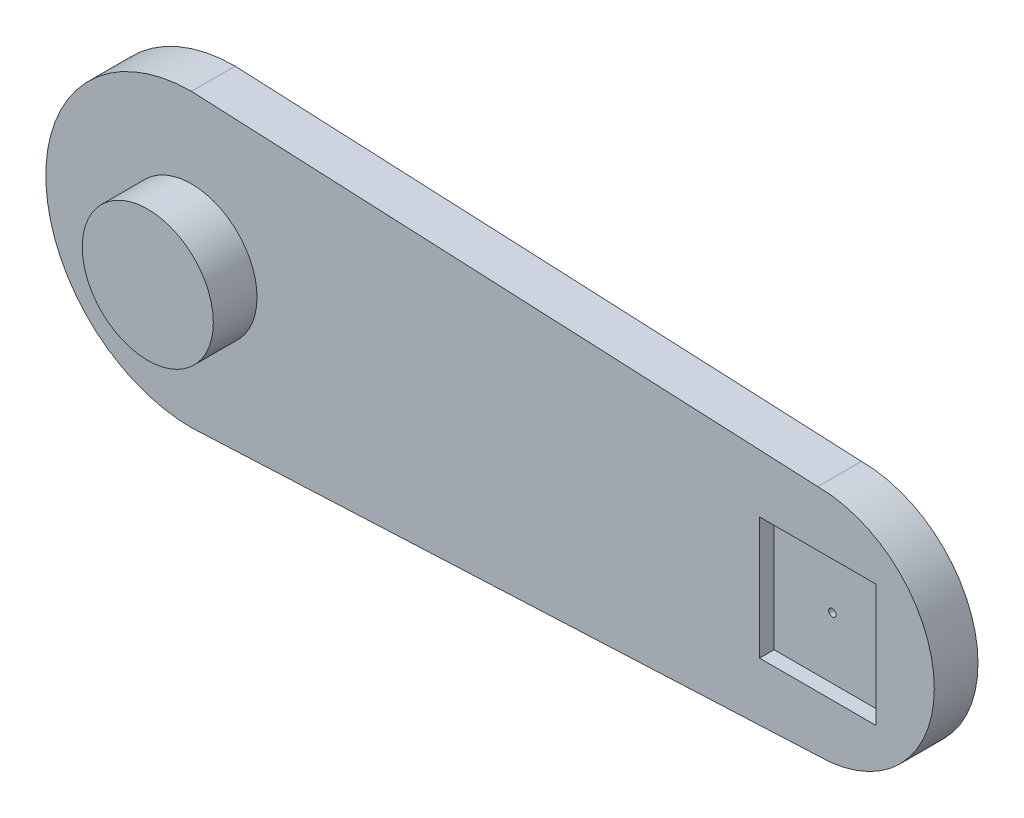
ISO-10303-21;
HEADER;
FILE_DESCRIPTION(('STEP AP214'),'2;1');
FILE_NAME('part.step','',(''),(''),'','','');
FILE_SCHEMA(('AUTOMOTIVE_DESIGN { 1 0 10303 214 1 1 1 1 }'));
ENDSEC;
DATA;
#1=APPLICATION_CONTEXT('core data for automotive mechanical design processes');
#2=APPLICATION_PROTOCOL_DEFINITION('international standard','automotive_design',2000,#1);
#3=PRODUCT_CONTEXT('',#1,'mechanical');
#4=PRODUCT('Part','Part','',(#3));
#5=PRODUCT_RELATED_PRODUCT_CATEGORY('part','',(#4));
#6=PRODUCT_DEFINITION_FORMATION('','',#4);
#7=PRODUCT_DEFINITION_CONTEXT('part definition',#1,'design');
#8=PRODUCT_DEFINITION('design','',#6,#7);
#9=PRODUCT_DEFINITION_SHAPE('','',#8);
#10=(LENGTH_UNIT() NAMED_UNIT(*) SI_UNIT(.MILLI.,.METRE.));
#11=(NAMED_UNIT(*) PLANE_ANGLE_UNIT() SI_UNIT($,.RADIAN.));
#12=(NAMED_UNIT(*) SI_UNIT($,.STERADIAN.) SOLID_ANGLE_UNIT());
#13=UNCERTAINTY_MEASURE_WITH_UNIT(LENGTH_MEASURE(1.E-05),#10,'distance_accuracy_value','');
#14=(GEOMETRIC_REPRESENTATION_CONTEXT(3) GLOBAL_UNCERTAINTY_ASSIGNED_CONTEXT((#13)) GLOBAL_UNIT_ASSIGNED_CONTEXT((#10,
#11,#12)) REPRESENTATION_CONTEXT('',''));
#15=CARTESIAN_POINT('',(0.,0.,0.));
#16=DIRECTION('',(0.,0.,1.));
#17=DIRECTION('',(1.,0.,0.));
#18=AXIS2_PLACEMENT_3D('',#15,#16,#17);
#19=CARTESIAN_POINT('',(215.,0.,15.));
#20=DIRECTION('',(0.,0.,-1.));
#21=DIRECTION('',(-1.,0.,0.));
#22=AXIS2_PLACEMENT_3D('',#19,#20,#21);
#23=CYLINDRICAL_SURFACE('',#22,40.);
#24=CARTESIAN_POINT('',(215.,0.,0.));
#25=DIRECTION('',(0.,0.,1.));
#26=DIRECTION('',(1.,0.,0.));
#27=AXIS2_PLACEMENT_3D('',#24,#25,#26);
#28=CIRCLE('',#27,40.);
#29=CARTESIAN_POINT('',(215.,-40.,0.));
#30=VERTEX_POINT('',#29);
#31=CARTESIAN_POINT('',(215.,40.,0.));
#32=VERTEX_POINT('',#31);
#33=EDGE_CURVE('E167',#30,#32,#28,.T.);
#34=ORIENTED_EDGE('',*,*,#33,.T.);
#35=DIRECTION('',(0.,0.,-1.));
#36=VECTOR('',#35,1.);
#37=CARTESIAN_POINT('',(215.,40.,15.));
#38=LINE('',#37,#36);
#39=CARTESIAN_POINT('',(215.,40.,15.));
#40=VERTEX_POINT('',#39);
#41=EDGE_CURVE('E11',#40,#32,#38,.T.);
#42=ORIENTED_EDGE('',*,*,#41,.F.);
#43=CARTESIAN_POINT('',(215.,0.,15.));
#44=DIRECTION('',(0.,0.,1.));
#45=DIRECTION('',(1.,0.,0.));
#46=AXIS2_PLACEMENT_3D('',#43,#44,#45);
#47=CIRCLE('',#46,40.);
#48=CARTESIAN_POINT('',(215.,-40.,15.));
#49=VERTEX_POINT('',#48);
#50=EDGE_CURVE('E89',#49,#40,#47,.T.);
#51=ORIENTED_EDGE('',*,*,#50,.F.);
#52=DIRECTION('',(0.,0.,-1.));
#53=VECTOR('',#52,1.);
#54=CARTESIAN_POINT('',(215.,-40.,15.));
#55=LINE('',#54,#53);
#56=EDGE_CURVE('E176',#49,#30,#55,.T.);
#57=ORIENTED_EDGE('',*,*,#56,.T.);
#58=EDGE_LOOP('',(#34,#42,#51,#57));
#59=FACE_BOUND('',#58,.T.);
#60=ADVANCED_FACE('F39',(#59),#23,.T.);
#61=CARTESIAN_POINT('',(2.32056125202375,49.8920669185105,15.));
#62=DIRECTION('',(0.0464613993524682,0.998920086078066,0.));
#63=DIRECTION('',(-0.998920086078066,0.0464613993524682,0.));
#64=AXIS2_PLACEMENT_3D('',#61,#62,#63);
#65=PLANE('',#64);
#66=DIRECTION('',(0.998920086078066,-0.0464613993524682,0.));
#67=VECTOR('',#66,1.);
#68=CARTESIAN_POINT('',(2.32056125202375,49.8920669185105,0.));
#69=LINE('',#68,#67);
#70=CARTESIAN_POINT('',(0.,50.,0.));
#71=VERTEX_POINT('',#70);
#72=EDGE_CURVE('E179',#71,#32,#69,.T.);
#73=ORIENTED_EDGE('',*,*,#72,.F.);
#74=DIRECTION('',(0.,0.,-1.));
#75=VECTOR('',#74,1.);
#76=CARTESIAN_POINT('',(0.,50.,15.));
#77=LINE('',#76,#75);
#78=CARTESIAN_POINT('',(0.,50.,15.));
#79=VERTEX_POINT('',#78);
#80=EDGE_CURVE('E47',#79,#71,#77,.T.);
#81=ORIENTED_EDGE('',*,*,#80,.F.);
#82=DIRECTION('',(0.998920086078066,-0.0464613993524682,0.));
#83=VECTOR('',#82,1.);
#84=CARTESIAN_POINT('',(2.32056125202375,49.8920669185105,15.));
#85=LINE('',#84,#83);
#86=EDGE_CURVE('E169',#79,#40,#85,.T.);
#87=ORIENTED_EDGE('',*,*,#86,.T.);
#88=ORIENTED_EDGE('',*,*,#41,.T.);
#89=EDGE_LOOP('',(#73,#81,#87,#88));
#90=FACE_BOUND('',#89,.T.);
#91=ADVANCED_FACE('F235',(#90),#65,.T.);
#92=CARTESIAN_POINT('',(0.,0.,15.));
#93=DIRECTION('',(0.,0.,-1.));
#94=DIRECTION('',(-1.,0.,0.));
#95=AXIS2_PLACEMENT_3D('',#92,#93,#94);
#96=CYLINDRICAL_SURFACE('',#95,50.);
#97=CARTESIAN_POINT('',(0.,0.,0.));
#98=DIRECTION('',(0.,0.,1.));
#99=DIRECTION('',(1.,0.,0.));
#100=AXIS2_PLACEMENT_3D('',#97,#98,#99);
#101=CIRCLE('',#100,50.);
#102=CARTESIAN_POINT('',(0.,-50.,0.));
#103=VERTEX_POINT('',#102);
#104=EDGE_CURVE('E182',#71,#103,#101,.T.);
#105=ORIENTED_EDGE('',*,*,#104,.T.);
#106=DIRECTION('',(0.,0.,-1.));
#107=VECTOR('',#106,1.);
#108=CARTESIAN_POINT('',(0.,-50.,15.));
#109=LINE('',#108,#107);
#110=CARTESIAN_POINT('',(0.,-50.,15.));
#111=VERTEX_POINT('',#110);
#112=EDGE_CURVE('E188',#111,#103,#109,.T.);
#113=ORIENTED_EDGE('',*,*,#112,.F.);
#114=CARTESIAN_POINT('',(0.,0.,15.));
#115=DIRECTION('',(0.,0.,1.));
#116=DIRECTION('',(1.,0.,0.));
#117=AXIS2_PLACEMENT_3D('',#114,#115,#116);
#118=CIRCLE('',#117,50.);
#119=EDGE_CURVE('E173',#79,#111,#118,.T.);
#120=ORIENTED_EDGE('',*,*,#119,.F.);
#121=ORIENTED_EDGE('',*,*,#80,.T.);
#122=EDGE_LOOP('',(#105,#113,#120,#121));
#123=FACE_BOUND('',#122,.T.);
#124=ADVANCED_FACE('F230',(#123),#96,.T.);
#125=CARTESIAN_POINT('',(2.32056125202375,-49.8920669185105,15.));
#126=DIRECTION('',(-0.0464613993524682,0.998920086078066,0.));
#127=DIRECTION('',(-0.998920086078066,-0.0464613993524682,0.));
#128=AXIS2_PLACEMENT_3D('',#125,#126,#127);
#129=PLANE('',#128);
#130=DIRECTION('',(0.998920086078066,0.0464613993524682,0.));
#131=VECTOR('',#130,1.);
#132=CARTESIAN_POINT('',(2.32056125202375,-49.8920669185105,0.));
#133=LINE('',#132,#131);
#134=EDGE_CURVE('E84',#103,#30,#133,.T.);
#135=ORIENTED_EDGE('',*,*,#134,.T.);
#136=ORIENTED_EDGE('',*,*,#56,.F.);
#137=DIRECTION('',(0.998920086078066,0.0464613993524682,0.));
#138=VECTOR('',#137,1.);
#139=CARTESIAN_POINT('',(2.32056125202375,-49.8920669185105,15.));
#140=LINE('',#139,#138);
#141=EDGE_CURVE('E64',#111,#49,#140,.T.);
#142=ORIENTED_EDGE('',*,*,#141,.F.);
#143=ORIENTED_EDGE('',*,*,#112,.T.);
#144=EDGE_LOOP('',(#135,#136,#142,#143));
#145=FACE_BOUND('',#144,.T.);
#146=ADVANCED_FACE('F221',(#145),#129,.F.);
#147=CARTESIAN_POINT('',(215.,0.,15.));
#148=DIRECTION('',(0.,0.,-1.));
#149=DIRECTION('',(-1.,0.,0.));
#150=AXIS2_PLACEMENT_3D('',#147,#148,#149);
#151=CYLINDRICAL_SURFACE('',#150,1.25000000000001);
#152=CARTESIAN_POINT('',(215.,0.,10.));
#153=DIRECTION('',(0.,0.,-1.));
#154=DIRECTION('',(-1.,0.,0.));
#155=AXIS2_PLACEMENT_3D('',#152,#153,#154);
#156=CIRCLE('',#155,1.25000000000001);
#157=CARTESIAN_POINT('',(213.75,0.,10.));
#158=VERTEX_POINT('',#157);
#159=EDGE_CURVE('E42',#158,#158,#156,.T.);
#160=ORIENTED_EDGE('',*,*,#159,.F.);
#161=EDGE_LOOP('',(#160));
#162=FACE_BOUND('',#161,.T.);
#163=CARTESIAN_POINT('',(215.,0.,0.));
#164=DIRECTION('',(0.,0.,1.));
#165=DIRECTION('',(1.,0.,0.));
#166=AXIS2_PLACEMENT_3D('',#163,#164,#165);
#167=CIRCLE('',#166,1.25000000000001);
#168=CARTESIAN_POINT('',(216.25,0.,0.));
#169=VERTEX_POINT('',#168);
#170=EDGE_CURVE('E170',#169,#169,#167,.T.);
#171=ORIENTED_EDGE('',*,*,#170,.F.);
#172=EDGE_LOOP('',(#171));
#173=FACE_BOUND('',#172,.T.);
#174=ADVANCED_FACE('F219',(#162,#173),#151,.F.);
#175=CARTESIAN_POINT('',(0.,0.,15.));
#176=DIRECTION('',(0.,0.,1.));
#177=DIRECTION('',(1.,0.,0.));
#178=AXIS2_PLACEMENT_3D('',#175,#176,#177);
#179=PLANE('',#178);
#180=DIRECTION('',(0.,1.,0.));
#181=VECTOR('',#180,1.);
#182=CARTESIAN_POINT('',(235.,-21.,15.));
#183=LINE('',#182,#181);
#184=CARTESIAN_POINT('',(235.,-21.,15.));
#185=VERTEX_POINT('',#184);
#186=CARTESIAN_POINT('',(235.,21.,15.));
#187=VERTEX_POINT('',#186);
#188=EDGE_CURVE('E55',#185,#187,#183,.T.);
#189=ORIENTED_EDGE('',*,*,#188,.F.);
#190=DIRECTION('',(1.,0.,0.));
#191=VECTOR('',#190,1.);
#192=CARTESIAN_POINT('',(195.,-21.,15.));
#193=LINE('',#192,#191);
#194=CARTESIAN_POINT('',(195.,-21.,15.));
#195=VERTEX_POINT('',#194);
#196=EDGE_CURVE('E133',#195,#185,#193,.T.);
#197=ORIENTED_EDGE('',*,*,#196,.F.);
#198=DIRECTION('',(0.,-1.,0.));
#199=VECTOR('',#198,1.);
#200=CARTESIAN_POINT('',(195.,-21.,15.));
#201=LINE('',#200,#199);
#202=CARTESIAN_POINT('',(195.,21.,15.));
#203=VERTEX_POINT('',#202);
#204=EDGE_CURVE('E136',#203,#195,#201,.T.);
#205=ORIENTED_EDGE('',*,*,#204,.F.);
#206=DIRECTION('',(-1.,0.,0.));
#207=VECTOR('',#206,1.);
#208=CARTESIAN_POINT('',(195.,21.,15.));
#209=LINE('',#208,#207);
#210=EDGE_CURVE('E142',#187,#203,#209,.T.);
#211=ORIENTED_EDGE('',*,*,#210,.F.);
#212=EDGE_LOOP('',(#189,#197,#205,#211));
#213=FACE_BOUND('',#212,.T.);
#214=CARTESIAN_POINT('',(0.,0.,15.));
#215=DIRECTION('',(0.,0.,1.));
#216=DIRECTION('',(1.,0.,0.));
#217=AXIS2_PLACEMENT_3D('',#214,#215,#216);
#218=CIRCLE('',#217,22.5);
#219=CARTESIAN_POINT('',(22.5,0.,15.));
#220=VERTEX_POINT('',#219);
#221=EDGE_CURVE('E162',#220,#220,#218,.T.);
#222=ORIENTED_EDGE('',*,*,#221,.F.);
#223=EDGE_LOOP('',(#222));
#224=FACE_BOUND('',#223,.T.);
#225=ORIENTED_EDGE('',*,*,#50,.T.);
#226=ORIENTED_EDGE('',*,*,#86,.F.);
#227=ORIENTED_EDGE('',*,*,#119,.T.);
#228=ORIENTED_EDGE('',*,*,#141,.T.);
#229=EDGE_LOOP('',(#225,#226,#227,#228));
#230=FACE_BOUND('',#229,.T.);
#231=ADVANCED_FACE('F213',(#213,#224,#230),#179,.T.);
#232=CARTESIAN_POINT('',(0.,0.,0.));
#233=DIRECTION('',(0.,0.,1.));
#234=DIRECTION('',(1.,0.,0.));
#235=AXIS2_PLACEMENT_3D('',#232,#233,#234);
#236=PLANE('',#235);
#237=CARTESIAN_POINT('',(0.,0.,0.));
#238=DIRECTION('',(0.,0.,-1.));
#239=DIRECTION('',(-1.,0.,0.));
#240=AXIS2_PLACEMENT_3D('',#237,#238,#239);
#241=CIRCLE('',#240,11.);
#242=CARTESIAN_POINT('',(-11.,0.,0.));
#243=VERTEX_POINT('',#242);
#244=EDGE_CURVE('E155',#243,#243,#241,.T.);
#245=ORIENTED_EDGE('',*,*,#244,.F.);
#246=EDGE_LOOP('',(#245));
#247=FACE_BOUND('',#246,.T.);
#248=ORIENTED_EDGE('',*,*,#33,.F.);
#249=ORIENTED_EDGE('',*,*,#134,.F.);
#250=ORIENTED_EDGE('',*,*,#104,.F.);
#251=ORIENTED_EDGE('',*,*,#72,.T.);
#252=EDGE_LOOP('',(#248,#249,#250,#251));
#253=FACE_BOUND('',#252,.T.);
#254=ORIENTED_EDGE('',*,*,#170,.T.);
#255=EDGE_LOOP('',(#254));
#256=FACE_BOUND('',#255,.T.);
#257=ADVANCED_FACE('F209',(#247,#253,#256),#236,.F.);
#258=CARTESIAN_POINT('',(0.,0.,30.));
#259=DIRECTION('',(0.,0.,1.));
#260=DIRECTION('',(1.,0.,0.));
#261=AXIS2_PLACEMENT_3D('',#258,#259,#260);
#262=PLANE('',#261);
#263=CARTESIAN_POINT('',(0.,0.,30.));
#264=DIRECTION('',(0.,0.,1.));
#265=DIRECTION('',(1.,0.,0.));
#266=AXIS2_PLACEMENT_3D('',#263,#264,#265);
#267=CIRCLE('',#266,22.5);
#268=CARTESIAN_POINT('',(22.5,0.,30.));
#269=VERTEX_POINT('',#268);
#270=EDGE_CURVE('E158',#269,#269,#267,.T.);
#271=ORIENTED_EDGE('',*,*,#270,.T.);
#272=EDGE_LOOP('',(#271));
#273=FACE_BOUND('',#272,.T.);
#274=ADVANCED_FACE('F212',(#273),#262,.T.);
#275=CARTESIAN_POINT('',(0.,0.,30.));
#276=DIRECTION('',(0.,0.,-1.));
#277=DIRECTION('',(-1.,0.,0.));
#278=AXIS2_PLACEMENT_3D('',#275,#276,#277);
#279=CYLINDRICAL_SURFACE('',#278,22.5);
#280=ORIENTED_EDGE('',*,*,#270,.F.);
#281=EDGE_LOOP('',(#280));
#282=FACE_BOUND('',#281,.T.);
#283=ORIENTED_EDGE('',*,*,#221,.T.);
#284=EDGE_LOOP('',(#283));
#285=FACE_BOUND('',#284,.T.);
#286=ADVANCED_FACE('F205',(#282,#285),#279,.T.);
#287=CARTESIAN_POINT('',(0.,0.,5.));
#288=DIRECTION('',(0.,0.,-1.));
#289=DIRECTION('',(-1.,0.,0.));
#290=AXIS2_PLACEMENT_3D('',#287,#288,#289);
#291=CYLINDRICAL_SURFACE('',#290,11.);
#292=CARTESIAN_POINT('',(0.,0.,5.));
#293=DIRECTION('',(0.,0.,-1.));
#294=DIRECTION('',(-1.,0.,0.));
#295=AXIS2_PLACEMENT_3D('',#292,#293,#294);
#296=CIRCLE('',#295,11.);
#297=CARTESIAN_POINT('',(-11.,0.,5.));
#298=VERTEX_POINT('',#297);
#299=EDGE_CURVE('E151',#298,#298,#296,.T.);
#300=ORIENTED_EDGE('',*,*,#299,.F.);
#301=EDGE_LOOP('',(#300));
#302=FACE_BOUND('',#301,.T.);
#303=ORIENTED_EDGE('',*,*,#244,.T.);
#304=EDGE_LOOP('',(#303));
#305=FACE_BOUND('',#304,.T.);
#306=ADVANCED_FACE('F199',(#302,#305),#291,.F.);
#307=CARTESIAN_POINT('',(0.,0.,5.));
#308=DIRECTION('',(0.,0.,-1.));
#309=DIRECTION('',(-1.,0.,0.));
#310=AXIS2_PLACEMENT_3D('',#307,#308,#309);
#311=PLANE('',#310);
#312=CARTESIAN_POINT('',(0.,0.,5.));
#313=DIRECTION('',(0.,0.,-1.));
#314=DIRECTION('',(-1.,0.,0.));
#315=AXIS2_PLACEMENT_3D('',#312,#313,#314);
#316=CIRCLE('',#315,1.25);
#317=CARTESIAN_POINT('',(-1.25,0.,5.));
#318=VERTEX_POINT('',#317);
#319=EDGE_CURVE('E154',#318,#318,#316,.T.);
#320=ORIENTED_EDGE('',*,*,#319,.F.);
#321=EDGE_LOOP('',(#320));
#322=FACE_BOUND('',#321,.T.);
#323=ORIENTED_EDGE('',*,*,#299,.T.);
#324=EDGE_LOOP('',(#323));
#325=FACE_BOUND('',#324,.T.);
#326=ADVANCED_FACE('F195',(#322,#325),#311,.T.);
#327=CARTESIAN_POINT('',(0.,0.,15.));
#328=DIRECTION('',(0.,0.,1.));
#329=DIRECTION('',(1.,0.,0.));
#330=AXIS2_PLACEMENT_3D('',#327,#328,#329);
#331=PLANE('',#330);
#332=CARTESIAN_POINT('',(0.,0.,15.));
#333=DIRECTION('',(0.,0.,1.));
#334=DIRECTION('',(1.,0.,0.));
#335=AXIS2_PLACEMENT_3D('',#332,#333,#334);
#336=CIRCLE('',#335,1.25);
#337=CARTESIAN_POINT('',(1.25,0.,15.));
#338=VERTEX_POINT('',#337);
#339=EDGE_CURVE('E161',#338,#338,#336,.T.);
#340=ORIENTED_EDGE('',*,*,#339,.F.);
#341=EDGE_LOOP('',(#340));
#342=FACE_BOUND('',#341,.T.);
#343=ADVANCED_FACE('F198',(#342),#331,.F.);
#344=CARTESIAN_POINT('',(0.,0.,15.));
#345=DIRECTION('',(0.,0.,-1.));
#346=DIRECTION('',(-1.,0.,0.));
#347=AXIS2_PLACEMENT_3D('',#344,#345,#346);
#348=CYLINDRICAL_SURFACE('',#347,1.25);
#349=ORIENTED_EDGE('',*,*,#339,.T.);
#350=EDGE_LOOP('',(#349));
#351=FACE_BOUND('',#350,.T.);
#352=ORIENTED_EDGE('',*,*,#319,.T.);
#353=EDGE_LOOP('',(#352));
#354=FACE_BOUND('',#353,.T.);
#355=ADVANCED_FACE('F193',(#351,#354),#348,.F.);
#356=CARTESIAN_POINT('',(235.,-21.,10.));
#357=DIRECTION('',(1.,0.,0.));
#358=DIRECTION('',(0.,0.,-1.));
#359=AXIS2_PLACEMENT_3D('',#356,#357,#358);
#360=PLANE('',#359);
#361=ORIENTED_EDGE('',*,*,#188,.T.);
#362=DIRECTION('',(0.,0.,1.));
#363=VECTOR('',#362,1.);
#364=CARTESIAN_POINT('',(235.,21.,10.));
#365=LINE('',#364,#363);
#366=CARTESIAN_POINT('',(235.,21.,10.));
#367=VERTEX_POINT('',#366);
#368=EDGE_CURVE('E111',#367,#187,#365,.T.);
#369=ORIENTED_EDGE('',*,*,#368,.F.);
#370=DIRECTION('',(0.,1.,0.));
#371=VECTOR('',#370,1.);
#372=CARTESIAN_POINT('',(235.,-21.,10.));
#373=LINE('',#372,#371);
#374=CARTESIAN_POINT('',(235.,-21.,10.));
#375=VERTEX_POINT('',#374);
#376=EDGE_CURVE('E115',#375,#367,#373,.T.);
#377=ORIENTED_EDGE('',*,*,#376,.F.);
#378=DIRECTION('',(0.,0.,1.));
#379=VECTOR('',#378,1.);
#380=CARTESIAN_POINT('',(235.,-21.,10.));
#381=LINE('',#380,#379);
#382=EDGE_CURVE('E146',#375,#185,#381,.T.);
#383=ORIENTED_EDGE('',*,*,#382,.T.);
#384=EDGE_LOOP('',(#361,#369,#377,#383));
#385=FACE_BOUND('',#384,.T.);
#386=ADVANCED_FACE('F113',(#385),#360,.F.);
#387=CARTESIAN_POINT('',(195.,-21.,10.));
#388=DIRECTION('',(0.,-1.,0.));
#389=DIRECTION('',(0.,0.,-1.));
#390=AXIS2_PLACEMENT_3D('',#387,#388,#389);
#391=PLANE('',#390);
#392=ORIENTED_EDGE('',*,*,#196,.T.);
#393=ORIENTED_EDGE('',*,*,#382,.F.);
#394=DIRECTION('',(1.,0.,0.));
#395=VECTOR('',#394,1.);
#396=CARTESIAN_POINT('',(195.,-21.,10.));
#397=LINE('',#396,#395);
#398=CARTESIAN_POINT('',(195.,-21.,10.));
#399=VERTEX_POINT('',#398);
#400=EDGE_CURVE('E121',#399,#375,#397,.T.);
#401=ORIENTED_EDGE('',*,*,#400,.F.);
#402=DIRECTION('',(0.,0.,1.));
#403=VECTOR('',#402,1.);
#404=CARTESIAN_POINT('',(195.,-21.,10.));
#405=LINE('',#404,#403);
#406=EDGE_CURVE('E148',#399,#195,#405,.T.);
#407=ORIENTED_EDGE('',*,*,#406,.T.);
#408=EDGE_LOOP('',(#392,#393,#401,#407));
#409=FACE_BOUND('',#408,.T.);
#410=ADVANCED_FACE('F256',(#409),#391,.F.);
#411=CARTESIAN_POINT('',(195.,-21.,10.));
#412=DIRECTION('',(-1.,0.,0.));
#413=DIRECTION('',(0.,0.,1.));
#414=AXIS2_PLACEMENT_3D('',#411,#412,#413);
#415=PLANE('',#414);
#416=ORIENTED_EDGE('',*,*,#204,.T.);
#417=ORIENTED_EDGE('',*,*,#406,.F.);
#418=DIRECTION('',(0.,-1.,0.));
#419=VECTOR('',#418,1.);
#420=CARTESIAN_POINT('',(195.,-21.,10.));
#421=LINE('',#420,#419);
#422=CARTESIAN_POINT('',(195.,21.,10.));
#423=VERTEX_POINT('',#422);
#424=EDGE_CURVE('E129',#423,#399,#421,.T.);
#425=ORIENTED_EDGE('',*,*,#424,.F.);
#426=DIRECTION('',(0.,0.,1.));
#427=VECTOR('',#426,1.);
#428=CARTESIAN_POINT('',(195.,21.,10.));
#429=LINE('',#428,#427);
#430=EDGE_CURVE('E120',#423,#203,#429,.T.);
#431=ORIENTED_EDGE('',*,*,#430,.T.);
#432=EDGE_LOOP('',(#416,#417,#425,#431));
#433=FACE_BOUND('',#432,.T.);
#434=ADVANCED_FACE('F308',(#433),#415,.F.);
#435=CARTESIAN_POINT('',(195.,21.,10.));
#436=DIRECTION('',(0.,1.,0.));
#437=DIRECTION('',(0.,0.,1.));
#438=AXIS2_PLACEMENT_3D('',#435,#436,#437);
#439=PLANE('',#438);
#440=ORIENTED_EDGE('',*,*,#210,.T.);
#441=ORIENTED_EDGE('',*,*,#430,.F.);
#442=DIRECTION('',(-1.,0.,0.));
#443=VECTOR('',#442,1.);
#444=CARTESIAN_POINT('',(195.,21.,10.));
#445=LINE('',#444,#443);
#446=EDGE_CURVE('E124',#367,#423,#445,.T.);
#447=ORIENTED_EDGE('',*,*,#446,.F.);
#448=ORIENTED_EDGE('',*,*,#368,.T.);
#449=EDGE_LOOP('',(#440,#441,#447,#448));
#450=FACE_BOUND('',#449,.T.);
#451=ADVANCED_FACE('F125',(#450),#439,.F.);
#452=CARTESIAN_POINT('',(0.,0.,10.));
#453=DIRECTION('',(0.,0.,-1.));
#454=DIRECTION('',(-1.,0.,0.));
#455=AXIS2_PLACEMENT_3D('',#452,#453,#454);
#456=PLANE('',#455);
#457=ORIENTED_EDGE('',*,*,#159,.T.);
#458=EDGE_LOOP('',(#457));
#459=FACE_BOUND('',#458,.T.);
#460=ORIENTED_EDGE('',*,*,#376,.T.);
#461=ORIENTED_EDGE('',*,*,#446,.T.);
#462=ORIENTED_EDGE('',*,*,#424,.T.);
#463=ORIENTED_EDGE('',*,*,#400,.T.);
#464=EDGE_LOOP('',(#460,#461,#462,#463));
#465=FACE_BOUND('',#464,.T.);
#466=ADVANCED_FACE('F131',(#459,#465),#456,.F.);
#467=CLOSED_SHELL('',(#60,#91,#124,#146,#174,#231,#257,#274,#286,#306,#326,#343,#355,#386,#410,
#434,#451,#466));
#468=MANIFOLD_SOLID_BREP('B2',#467);
#469=ADVANCED_BREP_SHAPE_REPRESENTATION('',(#18,#468),#14);
#470=SHAPE_DEFINITION_REPRESENTATION(#9,#469);
ENDSEC;
END-ISO-10303-21;
